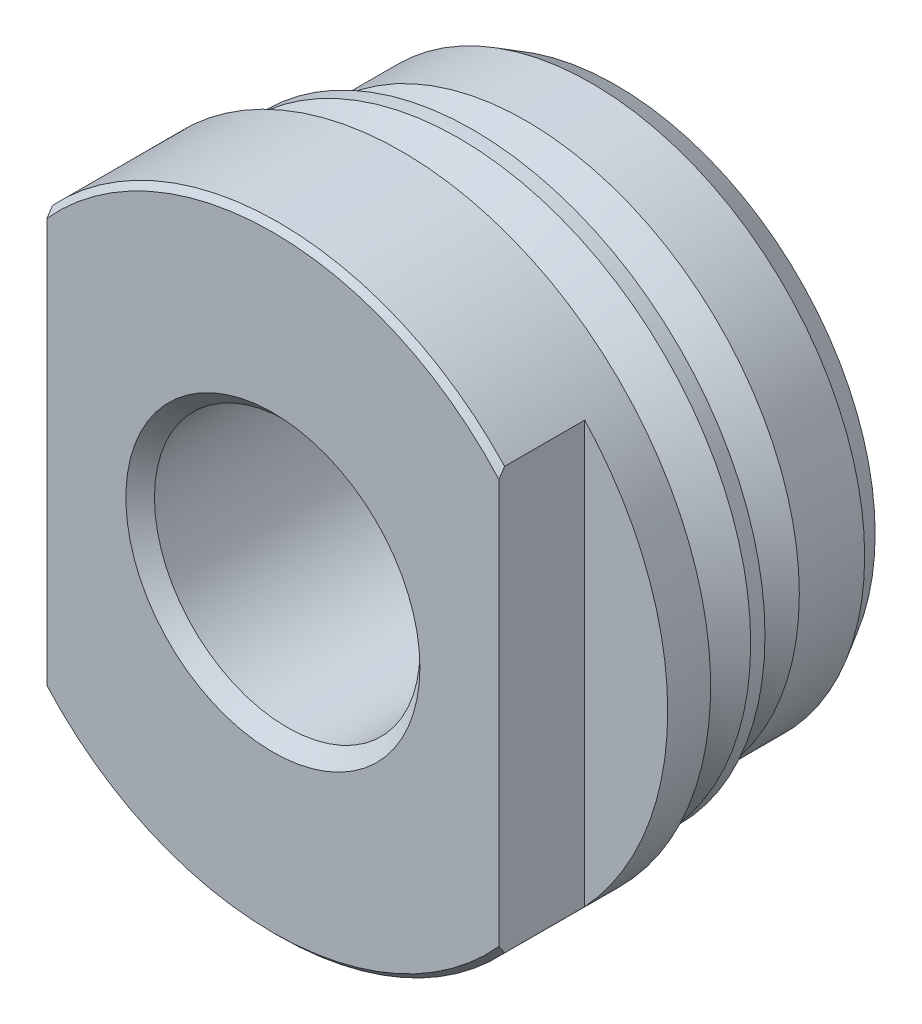
ISO-10303-21;
HEADER;
FILE_DESCRIPTION(('STEP AP214'),'2;1');
FILE_NAME('part.step','',(''),(''),'','','');
FILE_SCHEMA(('AUTOMOTIVE_DESIGN { 1 0 10303 214 1 1 1 1 }'));
ENDSEC;
DATA;
#1=APPLICATION_CONTEXT('core data for automotive mechanical design processes');
#2=APPLICATION_PROTOCOL_DEFINITION('international standard','automotive_design',2000,#1);
#3=PRODUCT_CONTEXT('',#1,'mechanical');
#4=PRODUCT('Part','Part','',(#3));
#5=PRODUCT_RELATED_PRODUCT_CATEGORY('part','',(#4));
#6=PRODUCT_DEFINITION_FORMATION('','',#4);
#7=PRODUCT_DEFINITION_CONTEXT('part definition',#1,'design');
#8=PRODUCT_DEFINITION('design','',#6,#7);
#9=PRODUCT_DEFINITION_SHAPE('','',#8);
#10=(LENGTH_UNIT() NAMED_UNIT(*) SI_UNIT(.MILLI.,.METRE.));
#11=(NAMED_UNIT(*) PLANE_ANGLE_UNIT() SI_UNIT($,.RADIAN.));
#12=(NAMED_UNIT(*) SI_UNIT($,.STERADIAN.) SOLID_ANGLE_UNIT());
#13=UNCERTAINTY_MEASURE_WITH_UNIT(LENGTH_MEASURE(1.E-05),#10,'distance_accuracy_value','');
#14=(GEOMETRIC_REPRESENTATION_CONTEXT(3) GLOBAL_UNCERTAINTY_ASSIGNED_CONTEXT((#13)) GLOBAL_UNIT_ASSIGNED_CONTEXT((#10,
#11,#12)) REPRESENTATION_CONTEXT('',''));
#15=CARTESIAN_POINT('',(0.,0.,0.));
#16=DIRECTION('',(0.,0.,1.));
#17=DIRECTION('',(1.,0.,0.));
#18=AXIS2_PLACEMENT_3D('',#15,#16,#17);
#19=CARTESIAN_POINT('',(0.,0.,12.));
#20=DIRECTION('',(0.,0.,-1.));
#21=DIRECTION('',(-1.,0.,0.));
#22=AXIS2_PLACEMENT_3D('',#19,#20,#21);
#23=CYLINDRICAL_SURFACE('',#22,10.8);
#24=CARTESIAN_POINT('',(0.,0.,11.8));
#25=DIRECTION('',(0.,0.,1.));
#26=DIRECTION('',(1.,0.,0.));
#27=AXIS2_PLACEMENT_3D('',#24,#25,#26);
#28=CIRCLE('',#27,10.8);
#29=CARTESIAN_POINT('',(7.90000000000001,-7.36410211770586,11.8));
#30=VERTEX_POINT('',#29);
#31=CARTESIAN_POINT('',(-7.90000000000001,-7.36410211770586,11.8));
#32=VERTEX_POINT('',#31);
#33=EDGE_CURVE('E114',#30,#32,#28,.F.);
#34=ORIENTED_EDGE('',*,*,#33,.T.);
#35=DIRECTION('',(0.,0.,-1.));
#36=VECTOR('',#35,1.);
#37=CARTESIAN_POINT('',(-7.90000000000001,-7.36410211770586,12.));
#38=LINE('',#37,#36);
#39=CARTESIAN_POINT('',(-7.90000000000001,-7.36410211770586,9.));
#40=VERTEX_POINT('',#39);
#41=EDGE_CURVE('E89',#32,#40,#38,.T.);
#42=ORIENTED_EDGE('',*,*,#41,.T.);
#43=CARTESIAN_POINT('',(0.,0.,9.));
#44=DIRECTION('',(0.,0.,1.));
#45=DIRECTION('',(1.,0.,0.));
#46=AXIS2_PLACEMENT_3D('',#43,#44,#45);
#47=CIRCLE('',#46,10.8);
#48=CARTESIAN_POINT('',(-7.90000000000001,7.36410211770586,9.));
#49=VERTEX_POINT('',#48);
#50=EDGE_CURVE('E93',#49,#40,#47,.T.);
#51=ORIENTED_EDGE('',*,*,#50,.F.);
#52=DIRECTION('',(0.,0.,-1.));
#53=VECTOR('',#52,1.);
#54=CARTESIAN_POINT('',(-7.90000000000001,7.36410211770586,12.));
#55=LINE('',#54,#53);
#56=CARTESIAN_POINT('',(-7.90000000000001,7.36410211770586,11.8));
#57=VERTEX_POINT('',#56);
#58=EDGE_CURVE('E193',#49,#57,#55,.F.);
#59=ORIENTED_EDGE('',*,*,#58,.T.);
#60=CARTESIAN_POINT('',(7.90000000000001,7.36410211770586,11.8));
#61=VERTEX_POINT('',#60);
#62=EDGE_CURVE('E108',#57,#61,#28,.F.);
#63=ORIENTED_EDGE('',*,*,#62,.T.);
#64=DIRECTION('',(0.,0.,-1.));
#65=VECTOR('',#64,1.);
#66=CARTESIAN_POINT('',(7.90000000000001,7.36410211770586,12.));
#67=LINE('',#66,#65);
#68=CARTESIAN_POINT('',(7.90000000000001,7.36410211770586,9.));
#69=VERTEX_POINT('',#68);
#70=EDGE_CURVE('E106',#61,#69,#67,.T.);
#71=ORIENTED_EDGE('',*,*,#70,.T.);
#72=CARTESIAN_POINT('',(0.,0.,9.));
#73=DIRECTION('',(0.,0.,-1.));
#74=DIRECTION('',(-1.,0.,0.));
#75=AXIS2_PLACEMENT_3D('',#72,#73,#74);
#76=CIRCLE('',#75,10.8);
#77=CARTESIAN_POINT('',(7.90000000000001,-7.36410211770586,9.));
#78=VERTEX_POINT('',#77);
#79=EDGE_CURVE('E124',#69,#78,#76,.T.);
#80=ORIENTED_EDGE('',*,*,#79,.T.);
#81=DIRECTION('',(0.,0.,-1.));
#82=VECTOR('',#81,1.);
#83=CARTESIAN_POINT('',(7.90000000000001,-7.36410211770586,12.));
#84=LINE('',#83,#82);
#85=EDGE_CURVE('E110',#78,#30,#84,.F.);
#86=ORIENTED_EDGE('',*,*,#85,.T.);
#87=EDGE_LOOP('',(#34,#42,#51,#59,#63,#71,#80,#86));
#88=FACE_BOUND('',#87,.T.);
#89=CARTESIAN_POINT('',(0.,0.,7.5));
#90=DIRECTION('',(0.,0.,-1.));
#91=DIRECTION('',(-1.,0.,0.));
#92=AXIS2_PLACEMENT_3D('',#89,#90,#91);
#93=CIRCLE('',#92,10.8);
#94=CARTESIAN_POINT('',(-10.8,0.,7.5));
#95=VERTEX_POINT('',#94);
#96=EDGE_CURVE('E101',#95,#95,#93,.T.);
#97=ORIENTED_EDGE('',*,*,#96,.F.);
#98=EDGE_LOOP('',(#97));
#99=FACE_BOUND('',#98,.T.);
#100=ADVANCED_FACE('F33',(#88,#99),#23,.T.);
#101=CARTESIAN_POINT('',(0.,0.,12.));
#102=DIRECTION('',(0.,0.,-1.));
#103=DIRECTION('',(-1.,0.,0.));
#104=AXIS2_PLACEMENT_3D('',#101,#102,#103);
#105=CONICAL_SURFACE('',#104,10.6,0.785398163397448);
#106=CARTESIAN_POINT('',(-7.90000000000001,-22.409004975791,-1.16075554364858));
#107=CARTESIAN_POINT('',(-7.90000000000001,-22.0508772172236,-0.823011495653775));
#108=CARTESIAN_POINT('',(-7.90000000000001,-21.6923116338694,-0.485730650169907));
#109=CARTESIAN_POINT('',(-7.90000000000001,-20.974152972954,0.187739463273151));
#110=CARTESIAN_POINT('',(-7.90000000000001,-20.6145598893184,0.523928724753929));
#111=CARTESIAN_POINT('',(-7.90000000000001,-19.8938852440171,1.19533844847555));
#112=CARTESIAN_POINT('',(-7.90000000000001,-19.5328026594999,1.53055781330608));
#113=CARTESIAN_POINT('',(-7.90000000000001,-18.8092710503213,2.19951794792509));
#114=CARTESIAN_POINT('',(-7.90000000000001,-18.4468220280248,2.53325872027024));
#115=CARTESIAN_POINT('',(-7.90000000000001,-17.7088381753738,3.20952719878338));
#116=CARTESIAN_POINT('',(-7.90000000000001,-17.3332520445957,3.55199895610959));
#117=CARTESIAN_POINT('',(-7.90000000000001,-16.5800688053,4.23472357361541));
#118=CARTESIAN_POINT('',(-7.90000000000001,-16.2024717019499,4.57497643949184));
#119=CARTESIAN_POINT('',(-7.90000000000001,-15.4451673580512,5.25253342938355));
#120=CARTESIAN_POINT('',(-7.90000000000001,-15.0654619862618,5.58983964024203));
#121=CARTESIAN_POINT('',(-7.90000000000001,-14.3031556467119,6.26116184898049));
#122=CARTESIAN_POINT('',(-7.90000000000001,-13.9205547021343,6.59517787315362));
#123=CARTESIAN_POINT('',(-7.90000000000001,-13.1521547280742,7.25882404246039));
#124=CARTESIAN_POINT('',(-7.90000000000001,-12.7663588350255,7.58845781381686));
#125=CARTESIAN_POINT('',(-7.90000000000001,-11.9903868922261,8.24257116234791));
#126=CARTESIAN_POINT('',(-7.90000000000001,-11.6002106776521,8.5670505444556));
#127=CARTESIAN_POINT('',(-7.90000000000001,-10.8133954061554,9.21015351468169));
#128=CARTESIAN_POINT('',(-7.90000000000001,-10.4167424473886,9.52876012983432));
#129=CARTESIAN_POINT('',(-7.90000000000001,-9.61650221145399,10.1571086563831));
#130=CARTESIAN_POINT('',(-7.90000000000001,-9.21291570050936,10.4668515373488));
#131=CARTESIAN_POINT('',(-7.90000000000001,-8.60363251252299,10.9203357217261));
#132=CARTESIAN_POINT('',(-7.90000000000001,-8.40132677564575,11.0686350360993));
#133=CARTESIAN_POINT('',(-7.90000000000001,-7.99422820469506,11.3617750880345));
#134=CARTESIAN_POINT('',(-7.90000000000001,-7.78943544354929,11.5066159266426));
#135=CARTESIAN_POINT('',(-7.90000000000001,-7.37689162284723,11.7923001587738));
#136=CARTESIAN_POINT('',(-7.90000000000001,-7.16913885240697,11.9331410868721));
#137=CARTESIAN_POINT('',(-7.90000000000001,-6.75041245476495,12.2099382314871));
#138=CARTESIAN_POINT('',(-7.90000000000001,-6.53943901402621,12.3458947292747));
#139=CARTESIAN_POINT('',(-7.90000000000001,-6.11473946064056,12.6113724416338));
#140=CARTESIAN_POINT('',(-7.90000000000001,-5.90102923133031,12.7409189819883));
#141=CARTESIAN_POINT('',(-7.90000000000001,-5.46946912044146,12.9930019889505));
#142=CARTESIAN_POINT('',(-7.90000000000001,-5.25161887184102,13.1155378301459));
#143=CARTESIAN_POINT('',(-7.90000000000001,-4.81156106925976,13.3519345644006));
#144=CARTESIAN_POINT('',(-7.90000000000001,-4.58935875804862,13.4658051743744));
#145=CARTESIAN_POINT('',(-7.90000000000001,-4.13994799595975,13.6831340147051));
#146=CARTESIAN_POINT('',(-7.90000000000001,-3.91274104087299,13.7865953060846));
#147=CARTESIAN_POINT('',(-7.90000000000001,-3.56449839003439,13.933734644084));
#148=CARTESIAN_POINT('',(-7.90000000000001,-3.44542292743046,13.9820678490954));
#149=CARTESIAN_POINT('',(-7.90000000000001,-3.20583253299374,14.0750269362474));
#150=CARTESIAN_POINT('',(-7.90000000000001,-3.08531756932179,14.1196527362125));
#151=CARTESIAN_POINT('',(-7.90000000000001,-2.72155606982376,14.2474358576262));
#152=CARTESIAN_POINT('',(-7.90000000000001,-2.47611335129694,14.324490143308));
#153=CARTESIAN_POINT('',(-7.90000000000001,-1.98130625415304,14.4587931594455));
#154=CARTESIAN_POINT('',(-7.90000000000001,-1.7319719851003,14.5161516622916));
#155=CARTESIAN_POINT('',(-7.90000000000001,-1.22918906625964,14.6087596985725));
#156=CARTESIAN_POINT('',(-7.90000000000001,-0.975740903213877,14.6440118282782));
#157=CARTESIAN_POINT('',(-7.90000000000001,-0.463792857135283,14.6905461427397));
#158=CARTESIAN_POINT('',(-7.90000000000001,-0.205268083226577,14.7015598869221));
#159=CARTESIAN_POINT('',(-7.90000000000001,0.311592433975256,14.6980823681367));
#160=CARTESIAN_POINT('',(-7.90000000000001,0.569928185766545,14.6835923325422));
#161=CARTESIAN_POINT('',(-7.90000000000001,1.08501218379488,14.629972376003));
#162=CARTESIAN_POINT('',(-7.90000000000001,1.34175019560777,14.5907458064372));
#163=CARTESIAN_POINT('',(-7.90000000000001,1.85078197276315,14.4899408833264));
#164=CARTESIAN_POINT('',(-7.90000000000001,2.10307453357972,14.428356566555));
#165=CARTESIAN_POINT('',(-7.90000000000001,2.7117833441311,14.2546283009818));
#166=CARTESIAN_POINT('',(-7.90000000000001,3.06523735100172,14.1321587844127));
#167=CARTESIAN_POINT('',(-7.90000000000001,3.75999116311813,13.8566894863437));
#168=CARTESIAN_POINT('',(-7.90000000000001,4.10128281517762,13.7036696624836));
#169=CARTESIAN_POINT('',(-7.90000000000001,4.60651767978826,13.4562460157599));
#170=CARTESIAN_POINT('',(-7.90000000000001,4.7746865728053,13.3702843897633));
#171=CARTESIAN_POINT('',(-7.90000000000001,5.10836648414615,13.1933335116649));
#172=CARTESIAN_POINT('',(-7.90000000000001,5.27387746910793,13.1023441965191));
#173=CARTESIAN_POINT('',(-7.90000000000001,5.60237144808786,12.9160815589019));
#174=CARTESIAN_POINT('',(-7.90000000000001,5.76535544504776,12.8208099977638));
#175=CARTESIAN_POINT('',(-7.90000000000001,6.08906863900119,12.6265352351118));
#176=CARTESIAN_POINT('',(-7.90000000000001,6.24979794429644,12.5275322136827));
#177=CARTESIAN_POINT('',(-7.90000000000001,6.60549172739751,12.3034306907861));
#178=CARTESIAN_POINT('',(-7.90000000000001,6.79993955286214,12.1775128730857));
#179=CARTESIAN_POINT('',(-7.90000000000001,7.18610565128359,11.9215520657389));
#180=CARTESIAN_POINT('',(-7.90000000000001,7.37782378336312,11.7915088642948));
#181=CARTESIAN_POINT('',(-7.90000000000001,7.9494335728376,11.3960939646874));
#182=CARTESIAN_POINT('',(-7.90000000000001,8.32570493982646,11.1254853284221));
#183=CARTESIAN_POINT('',(-7.90000000000001,9.07096199698265,10.5737908364136));
#184=CARTESIAN_POINT('',(-7.90000000000001,9.43994064709899,10.2926955472194));
#185=CARTESIAN_POINT('',(-7.90000000000001,10.1718028937388,9.72277577536293));
#186=CARTESIAN_POINT('',(-7.90000000000001,10.534687109878,9.4339520862784));
#187=CARTESIAN_POINT('',(-7.90000000000001,11.2569986772228,8.84918388557577));
#188=CARTESIAN_POINT('',(-7.90000000000001,11.6164070764972,8.55321603397223));
#189=CARTESIAN_POINT('',(-7.90000000000001,12.3312619153612,7.95652690646887));
#190=CARTESIAN_POINT('',(-7.90000000000001,12.6867082689038,7.65580552767424));
#191=CARTESIAN_POINT('',(-7.90000000000001,13.3941650329122,7.05072054617447));
#192=CARTESIAN_POINT('',(-7.90000000000001,13.7461771207873,6.7463589017697));
#193=CARTESIAN_POINT('',(-7.90000000000001,14.4475023120036,6.13455138397971));
#194=CARTESIAN_POINT('',(-7.90000000000001,14.7968154370055,5.8271055353926));
#195=CARTESIAN_POINT('',(-7.90000000000001,15.7626712988134,4.97076630063849));
#196=CARTESIAN_POINT('',(-7.90000000000001,16.3768060591838,4.41915759157725));
#197=CARTESIAN_POINT('',(-7.90000000000001,17.5999160456333,3.3100852102422));
#198=CARTESIAN_POINT('',(-7.90000000000001,18.2088904982423,2.75262068734549));
#199=CARTESIAN_POINT('',(-7.90000000000001,19.4181695498056,1.63762993398919));
#200=CARTESIAN_POINT('',(-7.90000000000001,20.0185048232777,1.08013694566367));
#201=CARTESIAN_POINT('',(-7.90000000000001,20.9166311937109,0.241465731552848));
#202=CARTESIAN_POINT('',(-7.90000000000001,21.2155834677101,-0.0384710470779498));
#203=CARTESIAN_POINT('',(-7.90000000000001,21.8127941965487,-0.599082164430036));
#204=CARTESIAN_POINT('',(-7.90000000000001,22.1110526532729,-0.879756501143304));
#205=CARTESIAN_POINT('',(-7.90000000000001,22.409004975791,-1.16075554364858));
#206=B_SPLINE_CURVE_WITH_KNOTS('',3,(#106,#107,#108,#109,#110,#111,#112,#113,#114,#115,#116,
#117,#118,#119,#120,#121,#122,#123,#124,#125,#126,#127,#128,#129,#130,#131,#132,#133,#134,#135,
#136,#137,#138,#139,#140,#141,#142,#143,#144,#145,#146,#147,#148,#149,#150,#151,#152,#153,#154,
#155,#156,#157,#158,#159,#160,#161,#162,#163,#164,#165,#166,#167,#168,#169,#170,#171,#172,#173,
#174,#175,#176,#177,#178,#179,#180,#181,#182,#183,#184,#185,#186,#187,#188,#189,#190,#191,#192,
#193,#194,#195,#196,#197,#198,#199,#200,#201,#202,#203,#204,#205),.UNSPECIFIED.,.F.,.F.,(4,2,2,
2,2,2,2,2,2,2,2,2,2,2,2,2,2,2,2,2,2,2,2,2,2,2,2,2,2,2,2,2,2,2,2,2,2,2,2,2,2,2,2,2,2,2,2,2,2,4),
(0.,1.47680084398303,2.95361043662997,4.43170494232693,5.90979689121079,7.43463924547816,
8.95947768330542,10.4831306339924,12.0067713986817,13.529061199459,15.0514084744113,
16.5776236957129,18.1036713270857,18.8561603032413,19.6086272669847,20.3615483830981,
21.1144260723926,21.8640423634022,22.6137254224539,23.3625550285296,24.1111637819653,
24.4966413397435,24.8821274394377,25.6531661864149,26.4198350943959,27.1864139444922,
27.9614408264338,28.7364304111082,29.5144668951426,30.2927110486022,31.4129386577925,
32.5339036154326,33.1004325372613,33.6669685646075,34.2332736647045,34.7995514691434,
35.4944593078476,36.189402881135,37.5795592847123,38.9709978993632,40.3622941806589,
41.7590056007582,43.1557472955699,44.5517686801852,45.947778849263,48.4241915804004,
50.9009691546592,53.3587573768038,54.587427920825,55.8160951232165),.UNSPECIFIED.);
#207=CARTESIAN_POINT('',(-7.90000000000001,-7.06753139363384,12.));
#208=VERTEX_POINT('',#207);
#209=EDGE_CURVE('E85',#32,#208,#206,.T.);
#210=ORIENTED_EDGE('',*,*,#209,.F.);
#211=ORIENTED_EDGE('',*,*,#33,.F.);
#212=CARTESIAN_POINT('',(7.90000000000001,22.409004975791,-1.16075554364858));
#213=CARTESIAN_POINT('',(7.90000000000001,22.0508772172236,-0.823011495653775));
#214=CARTESIAN_POINT('',(7.90000000000001,21.6923116338694,-0.485730650169907));
#215=CARTESIAN_POINT('',(7.90000000000001,20.974152972954,0.187739463273151));
#216=CARTESIAN_POINT('',(7.90000000000001,20.6145598893184,0.523928724753929));
#217=CARTESIAN_POINT('',(7.90000000000001,19.8938852440171,1.19533844847555));
#218=CARTESIAN_POINT('',(7.90000000000001,19.5328026594999,1.53055781330608));
#219=CARTESIAN_POINT('',(7.90000000000001,18.8092710503213,2.19951794792509));
#220=CARTESIAN_POINT('',(7.90000000000001,18.4468220280248,2.53325872027024));
#221=CARTESIAN_POINT('',(7.90000000000001,17.7088381753738,3.20952719878338));
#222=CARTESIAN_POINT('',(7.90000000000001,17.3332520445957,3.55199895610959));
#223=CARTESIAN_POINT('',(7.90000000000001,16.5800688053,4.23472357361541));
#224=CARTESIAN_POINT('',(7.90000000000001,16.2024717019499,4.57497643949184));
#225=CARTESIAN_POINT('',(7.90000000000001,15.4451673580512,5.25253342938355));
#226=CARTESIAN_POINT('',(7.90000000000001,15.0654619862618,5.58983964024203));
#227=CARTESIAN_POINT('',(7.90000000000001,14.3031556467119,6.26116184898049));
#228=CARTESIAN_POINT('',(7.90000000000001,13.9205547021343,6.59517787315362));
#229=CARTESIAN_POINT('',(7.90000000000001,13.1521547280742,7.25882404246039));
#230=CARTESIAN_POINT('',(7.90000000000001,12.7663588350255,7.58845781381686));
#231=CARTESIAN_POINT('',(7.90000000000001,11.9903868922261,8.24257116234791));
#232=CARTESIAN_POINT('',(7.90000000000001,11.6002106776521,8.5670505444556));
#233=CARTESIAN_POINT('',(7.90000000000001,10.8133954061554,9.21015351468169));
#234=CARTESIAN_POINT('',(7.90000000000001,10.4167424473886,9.52876012983432));
#235=CARTESIAN_POINT('',(7.90000000000001,9.61650221145399,10.1571086563831));
#236=CARTESIAN_POINT('',(7.90000000000001,9.21291570050936,10.4668515373488));
#237=CARTESIAN_POINT('',(7.90000000000001,8.60363251252299,10.9203357217261));
#238=CARTESIAN_POINT('',(7.90000000000001,8.40132677564575,11.0686350360993));
#239=CARTESIAN_POINT('',(7.90000000000001,7.99422820469506,11.3617750880345));
#240=CARTESIAN_POINT('',(7.90000000000001,7.78943544354929,11.5066159266426));
#241=CARTESIAN_POINT('',(7.90000000000001,7.37689162284723,11.7923001587738));
#242=CARTESIAN_POINT('',(7.90000000000001,7.16913885240697,11.9331410868721));
#243=CARTESIAN_POINT('',(7.90000000000001,6.75041245476495,12.2099382314871));
#244=CARTESIAN_POINT('',(7.90000000000001,6.53943901402621,12.3458947292747));
#245=CARTESIAN_POINT('',(7.90000000000001,6.11473946064056,12.6113724416338));
#246=CARTESIAN_POINT('',(7.90000000000001,5.90102923133031,12.7409189819883));
#247=CARTESIAN_POINT('',(7.90000000000001,5.46946912044146,12.9930019889505));
#248=CARTESIAN_POINT('',(7.90000000000001,5.25161887184102,13.1155378301459));
#249=CARTESIAN_POINT('',(7.90000000000001,4.81156106925976,13.3519345644006));
#250=CARTESIAN_POINT('',(7.90000000000001,4.58935875804862,13.4658051743744));
#251=CARTESIAN_POINT('',(7.90000000000001,4.13994799595975,13.6831340147051));
#252=CARTESIAN_POINT('',(7.90000000000001,3.91274104087299,13.7865953060846));
#253=CARTESIAN_POINT('',(7.90000000000001,3.56449839003439,13.933734644084));
#254=CARTESIAN_POINT('',(7.90000000000001,3.44542292743046,13.9820678490954));
#255=CARTESIAN_POINT('',(7.90000000000001,3.20583253299374,14.0750269362474));
#256=CARTESIAN_POINT('',(7.90000000000001,3.08531756932179,14.1196527362125));
#257=CARTESIAN_POINT('',(7.90000000000001,2.72155606982376,14.2474358576262));
#258=CARTESIAN_POINT('',(7.90000000000001,2.47611335129694,14.324490143308));
#259=CARTESIAN_POINT('',(7.90000000000001,1.98130625415304,14.4587931594455));
#260=CARTESIAN_POINT('',(7.90000000000001,1.7319719851003,14.5161516622916));
#261=CARTESIAN_POINT('',(7.90000000000001,1.22918906625964,14.6087596985725));
#262=CARTESIAN_POINT('',(7.90000000000001,0.975740903213877,14.6440118282782));
#263=CARTESIAN_POINT('',(7.90000000000001,0.463792857135283,14.6905461427397));
#264=CARTESIAN_POINT('',(7.90000000000001,0.205268083226577,14.7015598869221));
#265=CARTESIAN_POINT('',(7.90000000000001,-0.311592433975256,14.6980823681367));
#266=CARTESIAN_POINT('',(7.90000000000001,-0.569928185766545,14.6835923325422));
#267=CARTESIAN_POINT('',(7.90000000000001,-1.08501218379488,14.629972376003));
#268=CARTESIAN_POINT('',(7.90000000000001,-1.34175019560777,14.5907458064372));
#269=CARTESIAN_POINT('',(7.90000000000001,-1.85078197276315,14.4899408833264));
#270=CARTESIAN_POINT('',(7.90000000000001,-2.10307453357972,14.428356566555));
#271=CARTESIAN_POINT('',(7.90000000000001,-2.7117833441311,14.2546283009818));
#272=CARTESIAN_POINT('',(7.90000000000001,-3.06523735100172,14.1321587844127));
#273=CARTESIAN_POINT('',(7.90000000000001,-3.75999116311813,13.8566894863437));
#274=CARTESIAN_POINT('',(7.90000000000001,-4.10128281517762,13.7036696624836));
#275=CARTESIAN_POINT('',(7.90000000000001,-4.60651767978826,13.4562460157599));
#276=CARTESIAN_POINT('',(7.90000000000001,-4.7746865728053,13.3702843897633));
#277=CARTESIAN_POINT('',(7.90000000000001,-5.10836648414615,13.1933335116649));
#278=CARTESIAN_POINT('',(7.90000000000001,-5.27387746910793,13.1023441965191));
#279=CARTESIAN_POINT('',(7.90000000000001,-5.60237144808786,12.9160815589019));
#280=CARTESIAN_POINT('',(7.90000000000001,-5.76535544504776,12.8208099977638));
#281=CARTESIAN_POINT('',(7.90000000000001,-6.08906863900119,12.6265352351118));
#282=CARTESIAN_POINT('',(7.90000000000001,-6.24979794429644,12.5275322136827));
#283=CARTESIAN_POINT('',(7.90000000000001,-6.60549172739751,12.3034306907861));
#284=CARTESIAN_POINT('',(7.90000000000001,-6.79993955286214,12.1775128730857));
#285=CARTESIAN_POINT('',(7.90000000000001,-7.18610565128359,11.9215520657389));
#286=CARTESIAN_POINT('',(7.90000000000001,-7.37782378336312,11.7915088642948));
#287=CARTESIAN_POINT('',(7.90000000000001,-7.9494335728376,11.3960939646874));
#288=CARTESIAN_POINT('',(7.90000000000001,-8.32570493982646,11.1254853284221));
#289=CARTESIAN_POINT('',(7.90000000000001,-9.07096199698265,10.5737908364136));
#290=CARTESIAN_POINT('',(7.90000000000001,-9.43994064709899,10.2926955472194));
#291=CARTESIAN_POINT('',(7.90000000000001,-10.1718028937388,9.72277577536293));
#292=CARTESIAN_POINT('',(7.90000000000001,-10.534687109878,9.4339520862784));
#293=CARTESIAN_POINT('',(7.90000000000001,-11.2569986772228,8.84918388557577));
#294=CARTESIAN_POINT('',(7.90000000000001,-11.6164070764972,8.55321603397223));
#295=CARTESIAN_POINT('',(7.90000000000001,-12.3312619153612,7.95652690646887));
#296=CARTESIAN_POINT('',(7.90000000000001,-12.6867082689038,7.65580552767424));
#297=CARTESIAN_POINT('',(7.90000000000001,-13.3941650329122,7.05072054617447));
#298=CARTESIAN_POINT('',(7.90000000000001,-13.7461771207873,6.7463589017697));
#299=CARTESIAN_POINT('',(7.90000000000001,-14.4475023120036,6.13455138397971));
#300=CARTESIAN_POINT('',(7.90000000000001,-14.7968154370055,5.8271055353926));
#301=CARTESIAN_POINT('',(7.90000000000001,-15.7626712988134,4.97076630063849));
#302=CARTESIAN_POINT('',(7.90000000000001,-16.3768060591838,4.41915759157725));
#303=CARTESIAN_POINT('',(7.90000000000001,-17.5999160456333,3.3100852102422));
#304=CARTESIAN_POINT('',(7.90000000000001,-18.2088904982423,2.75262068734549));
#305=CARTESIAN_POINT('',(7.90000000000001,-19.4181695498056,1.63762993398919));
#306=CARTESIAN_POINT('',(7.90000000000001,-20.0185048232777,1.08013694566367));
#307=CARTESIAN_POINT('',(7.90000000000001,-20.9166311937109,0.241465731552848));
#308=CARTESIAN_POINT('',(7.90000000000001,-21.2155834677101,-0.0384710470779498));
#309=CARTESIAN_POINT('',(7.90000000000001,-21.8127941965487,-0.599082164430036));
#310=CARTESIAN_POINT('',(7.90000000000001,-22.1110526532729,-0.879756501143304));
#311=CARTESIAN_POINT('',(7.90000000000001,-22.409004975791,-1.16075554364858));
#312=B_SPLINE_CURVE_WITH_KNOTS('',3,(#212,#213,#214,#215,#216,#217,#218,#219,#220,#221,#222,
#223,#224,#225,#226,#227,#228,#229,#230,#231,#232,#233,#234,#235,#236,#237,#238,#239,#240,#241,
#242,#243,#244,#245,#246,#247,#248,#249,#250,#251,#252,#253,#254,#255,#256,#257,#258,#259,#260,
#261,#262,#263,#264,#265,#266,#267,#268,#269,#270,#271,#272,#273,#274,#275,#276,#277,#278,#279,
#280,#281,#282,#283,#284,#285,#286,#287,#288,#289,#290,#291,#292,#293,#294,#295,#296,#297,#298,
#299,#300,#301,#302,#303,#304,#305,#306,#307,#308,#309,#310,#311),.UNSPECIFIED.,.F.,.F.,(4,2,2,
2,2,2,2,2,2,2,2,2,2,2,2,2,2,2,2,2,2,2,2,2,2,2,2,2,2,2,2,2,2,2,2,2,2,2,2,2,2,2,2,2,2,2,2,2,2,4),
(0.,1.47680084398303,2.95361043662997,4.43170494232693,5.90979689121079,7.43463924547816,
8.95947768330542,10.4831306339924,12.0067713986817,13.529061199459,15.0514084744113,
16.5776236957129,18.1036713270857,18.8561603032413,19.6086272669847,20.3615483830981,
21.1144260723926,21.8640423634022,22.6137254224539,23.3625550285296,24.1111637819653,
24.4966413397435,24.8821274394377,25.6531661864149,26.4198350943959,27.1864139444922,
27.9614408264338,28.7364304111082,29.5144668951426,30.2927110486022,31.4129386577925,
32.5339036154326,33.1004325372613,33.6669685646075,34.2332736647045,34.7995514691434,
35.4944593078476,36.189402881135,37.5795592847123,38.9709978993632,40.3622941806589,
41.7590056007582,43.1557472955699,44.5517686801852,45.947778849263,48.4241915804004,
50.9009691546592,53.3587573768038,54.587427920825,55.8160951232165),.UNSPECIFIED.);
#313=CARTESIAN_POINT('',(7.90000000000001,-7.06753139363384,12.));
#314=VERTEX_POINT('',#313);
#315=EDGE_CURVE('E105',#314,#30,#312,.T.);
#316=ORIENTED_EDGE('',*,*,#315,.F.);
#317=CARTESIAN_POINT('',(0.,0.,12.));
#318=DIRECTION('',(0.,0.,1.));
#319=DIRECTION('',(1.,0.,0.));
#320=AXIS2_PLACEMENT_3D('',#317,#318,#319);
#321=CIRCLE('',#320,10.6);
#322=EDGE_CURVE('E55',#208,#314,#321,.T.);
#323=ORIENTED_EDGE('',*,*,#322,.F.);
#324=EDGE_LOOP('',(#210,#211,#316,#323));
#325=FACE_BOUND('',#324,.T.);
#326=ADVANCED_FACE('F104',(#325),#105,.T.);
#327=CARTESIAN_POINT('',(0.,0.,12.));
#328=DIRECTION('',(0.,0.,1.));
#329=DIRECTION('',(1.,0.,0.));
#330=AXIS2_PLACEMENT_3D('',#327,#328,#329);
#331=PLANE('',#330);
#332=CARTESIAN_POINT('',(0.,0.,12.));
#333=DIRECTION('',(0.,0.,1.));
#334=DIRECTION('',(1.,0.,0.));
#335=AXIS2_PLACEMENT_3D('',#332,#333,#334);
#336=CIRCLE('',#335,5.139);
#337=CARTESIAN_POINT('',(5.139,0.,12.));
#338=VERTEX_POINT('',#337);
#339=EDGE_CURVE('E216',#338,#338,#336,.F.);
#340=ORIENTED_EDGE('',*,*,#339,.T.);
#341=EDGE_LOOP('',(#340));
#342=FACE_BOUND('',#341,.T.);
#343=DIRECTION('',(0.,1.,0.));
#344=VECTOR('',#343,1.);
#345=CARTESIAN_POINT('',(-7.90000000000001,37.5,12.));
#346=LINE('',#345,#344);
#347=CARTESIAN_POINT('',(-7.90000000000001,7.06753139363384,12.));
#348=VERTEX_POINT('',#347);
#349=EDGE_CURVE('E48',#208,#348,#346,.T.);
#350=ORIENTED_EDGE('',*,*,#349,.F.);
#351=ORIENTED_EDGE('',*,*,#322,.T.);
#352=DIRECTION('',(0.,-1.,0.));
#353=VECTOR('',#352,1.);
#354=CARTESIAN_POINT('',(7.90000000000001,37.5,12.));
#355=LINE('',#354,#353);
#356=CARTESIAN_POINT('',(7.90000000000001,7.06753139363384,12.));
#357=VERTEX_POINT('',#356);
#358=EDGE_CURVE('E198',#357,#314,#355,.T.);
#359=ORIENTED_EDGE('',*,*,#358,.F.);
#360=EDGE_CURVE('E99',#357,#348,#321,.T.);
#361=ORIENTED_EDGE('',*,*,#360,.T.);
#362=EDGE_LOOP('',(#350,#351,#359,#361));
#363=FACE_BOUND('',#362,.T.);
#364=ADVANCED_FACE('F97',(#342,#363),#331,.T.);
#365=EDGE_CURVE('E94',#348,#57,#206,.T.);
#366=ORIENTED_EDGE('',*,*,#365,.F.);
#367=ORIENTED_EDGE('',*,*,#360,.F.);
#368=EDGE_CURVE('E123',#61,#357,#312,.T.);
#369=ORIENTED_EDGE('',*,*,#368,.F.);
#370=ORIENTED_EDGE('',*,*,#62,.F.);
#371=EDGE_LOOP('',(#366,#367,#369,#370));
#372=FACE_BOUND('',#371,.T.);
#373=ADVANCED_FACE('F125',(#372),#105,.T.);
#374=CARTESIAN_POINT('',(17.9,37.5,9.));
#375=DIRECTION('',(0.,0.,-1.));
#376=DIRECTION('',(-1.,0.,0.));
#377=AXIS2_PLACEMENT_3D('',#374,#375,#376);
#378=PLANE('',#377);
#379=DIRECTION('',(0.,-1.,0.));
#380=VECTOR('',#379,1.);
#381=CARTESIAN_POINT('',(7.90000000000001,37.5,9.));
#382=LINE('',#381,#380);
#383=EDGE_CURVE('E199',#69,#78,#382,.T.);
#384=ORIENTED_EDGE('',*,*,#383,.T.);
#385=ORIENTED_EDGE('',*,*,#79,.F.);
#386=EDGE_LOOP('',(#384,#385));
#387=FACE_BOUND('',#386,.T.);
#388=ADVANCED_FACE('F134',(#387),#378,.F.);
#389=CARTESIAN_POINT('',(7.90000000000001,37.5,9.));
#390=DIRECTION('',(-1.,0.,0.));
#391=DIRECTION('',(0.,0.,1.));
#392=AXIS2_PLACEMENT_3D('',#389,#390,#391);
#393=PLANE('',#392);
#394=ORIENTED_EDGE('',*,*,#368,.T.);
#395=ORIENTED_EDGE('',*,*,#358,.T.);
#396=ORIENTED_EDGE('',*,*,#315,.T.);
#397=ORIENTED_EDGE('',*,*,#85,.F.);
#398=ORIENTED_EDGE('',*,*,#383,.F.);
#399=ORIENTED_EDGE('',*,*,#70,.F.);
#400=EDGE_LOOP('',(#394,#395,#396,#397,#398,#399));
#401=FACE_BOUND('',#400,.T.);
#402=ADVANCED_FACE('F128',(#401),#393,.F.);
#403=CARTESIAN_POINT('',(-17.9,37.5,9.));
#404=DIRECTION('',(0.,0.,1.));
#405=DIRECTION('',(1.,0.,0.));
#406=AXIS2_PLACEMENT_3D('',#403,#404,#405);
#407=PLANE('',#406);
#408=ORIENTED_EDGE('',*,*,#50,.T.);
#409=DIRECTION('',(0.,1.,0.));
#410=VECTOR('',#409,1.);
#411=CARTESIAN_POINT('',(-7.90000000000001,37.5,9.));
#412=LINE('',#411,#410);
#413=EDGE_CURVE('E100',#40,#49,#412,.T.);
#414=ORIENTED_EDGE('',*,*,#413,.T.);
#415=EDGE_LOOP('',(#408,#414));
#416=FACE_BOUND('',#415,.T.);
#417=ADVANCED_FACE('F133',(#416),#407,.T.);
#418=CARTESIAN_POINT('',(-7.90000000000001,37.5,9.));
#419=DIRECTION('',(1.,0.,0.));
#420=DIRECTION('',(0.,0.,-1.));
#421=AXIS2_PLACEMENT_3D('',#418,#419,#420);
#422=PLANE('',#421);
#423=ORIENTED_EDGE('',*,*,#209,.T.);
#424=ORIENTED_EDGE('',*,*,#349,.T.);
#425=ORIENTED_EDGE('',*,*,#365,.T.);
#426=ORIENTED_EDGE('',*,*,#58,.F.);
#427=ORIENTED_EDGE('',*,*,#413,.F.);
#428=ORIENTED_EDGE('',*,*,#41,.F.);
#429=EDGE_LOOP('',(#423,#424,#425,#426,#427,#428));
#430=FACE_BOUND('',#429,.T.);
#431=ADVANCED_FACE('F86',(#430),#422,.F.);
#432=CARTESIAN_POINT('',(0.,13.6,7.5));
#433=DIRECTION('',(0.,0.,-1.));
#434=DIRECTION('',(-1.,0.,0.));
#435=AXIS2_PLACEMENT_3D('',#432,#433,#434);
#436=PLANE('',#435);
#437=CARTESIAN_POINT('',(0.,0.,7.5));
#438=DIRECTION('',(0.,0.,1.));
#439=DIRECTION('',(1.,0.,0.));
#440=AXIS2_PLACEMENT_3D('',#437,#438,#439);
#441=CIRCLE('',#440,8.6);
#442=CARTESIAN_POINT('',(8.6,0.,7.5));
#443=VERTEX_POINT('',#442);
#444=EDGE_CURVE('E189',#443,#443,#441,.T.);
#445=ORIENTED_EDGE('',*,*,#444,.T.);
#446=EDGE_LOOP('',(#445));
#447=FACE_BOUND('',#446,.T.);
#448=ORIENTED_EDGE('',*,*,#96,.T.);
#449=EDGE_LOOP('',(#448));
#450=FACE_BOUND('',#449,.T.);
#451=ADVANCED_FACE('F271',(#447,#450),#436,.T.);
#452=CARTESIAN_POINT('',(0.,0.,0.));
#453=DIRECTION('',(0.,0.,1.));
#454=DIRECTION('',(1.,0.,0.));
#455=AXIS2_PLACEMENT_3D('',#452,#453,#454);
#456=CYLINDRICAL_SURFACE('',#455,8.6);
#457=CARTESIAN_POINT('',(0.,0.,7.09999999999999));
#458=DIRECTION('',(0.,0.,1.));
#459=DIRECTION('',(1.,0.,0.));
#460=AXIS2_PLACEMENT_3D('',#457,#458,#459);
#461=CIRCLE('',#460,8.6);
#462=CARTESIAN_POINT('',(8.6,0.,7.09999999999999));
#463=VERTEX_POINT('',#462);
#464=EDGE_CURVE('E186',#463,#463,#461,.T.);
#465=ORIENTED_EDGE('',*,*,#464,.T.);
#466=EDGE_LOOP('',(#465));
#467=FACE_BOUND('',#466,.T.);
#468=ORIENTED_EDGE('',*,*,#444,.F.);
#469=EDGE_LOOP('',(#468));
#470=FACE_BOUND('',#469,.T.);
#471=ADVANCED_FACE('F267',(#467,#470),#456,.T.);
#472=CARTESIAN_POINT('',(0.,0.,7.09999999999999));
#473=DIRECTION('',(0.,0.,-1.));
#474=DIRECTION('',(-1.,0.,0.));
#475=AXIS2_PLACEMENT_3D('',#472,#473,#474);
#476=CONICAL_SURFACE('',#475,8.6,0.78539816339745);
#477=CARTESIAN_POINT('',(0.,0.,5.5));
#478=DIRECTION('',(0.,0.,1.));
#479=DIRECTION('',(1.,0.,0.));
#480=AXIS2_PLACEMENT_3D('',#477,#478,#479);
#481=CIRCLE('',#480,10.2);
#482=CARTESIAN_POINT('',(10.2,0.,5.5));
#483=VERTEX_POINT('',#482);
#484=EDGE_CURVE('E183',#483,#483,#481,.T.);
#485=ORIENTED_EDGE('',*,*,#484,.T.);
#486=EDGE_LOOP('',(#485));
#487=FACE_BOUND('',#486,.T.);
#488=ORIENTED_EDGE('',*,*,#464,.F.);
#489=EDGE_LOOP('',(#488));
#490=FACE_BOUND('',#489,.T.);
#491=ADVANCED_FACE('F263',(#487,#490),#476,.T.);
#492=CARTESIAN_POINT('',(0.,0.,0.));
#493=DIRECTION('',(0.,0.,1.));
#494=DIRECTION('',(1.,0.,0.));
#495=AXIS2_PLACEMENT_3D('',#492,#493,#494);
#496=CYLINDRICAL_SURFACE('',#495,10.2);
#497=CARTESIAN_POINT('',(0.,0.,5.));
#498=DIRECTION('',(0.,0.,1.));
#499=DIRECTION('',(1.,0.,0.));
#500=AXIS2_PLACEMENT_3D('',#497,#498,#499);
#501=CIRCLE('',#500,10.2);
#502=CARTESIAN_POINT('',(10.2,0.,5.));
#503=VERTEX_POINT('',#502);
#504=EDGE_CURVE('E174',#503,#503,#501,.T.);
#505=ORIENTED_EDGE('',*,*,#504,.T.);
#506=EDGE_LOOP('',(#505));
#507=FACE_BOUND('',#506,.T.);
#508=ORIENTED_EDGE('',*,*,#484,.F.);
#509=EDGE_LOOP('',(#508));
#510=FACE_BOUND('',#509,.T.);
#511=ADVANCED_FACE('F144',(#507,#510),#496,.T.);
#512=CARTESIAN_POINT('',(0.,0.,5.));
#513=DIRECTION('',(0.,0.,1.));
#514=DIRECTION('',(1.,0.,0.));
#515=AXIS2_PLACEMENT_3D('',#512,#513,#514);
#516=PLANE('',#515);
#517=ORIENTED_EDGE('',*,*,#504,.F.);
#518=EDGE_LOOP('',(#517));
#519=FACE_BOUND('',#518,.T.);
#520=CARTESIAN_POINT('',(0.,0.,5.));
#521=DIRECTION('',(0.,0.,1.));
#522=DIRECTION('',(1.,0.,0.));
#523=AXIS2_PLACEMENT_3D('',#520,#521,#522);
#524=CIRCLE('',#523,8.6);
#525=CARTESIAN_POINT('',(8.6,0.,5.));
#526=VERTEX_POINT('',#525);
#527=EDGE_CURVE('E171',#526,#526,#524,.T.);
#528=ORIENTED_EDGE('',*,*,#527,.T.);
#529=EDGE_LOOP('',(#528));
#530=FACE_BOUND('',#529,.T.);
#531=ADVANCED_FACE('F140',(#519,#530),#516,.F.);
#532=CARTESIAN_POINT('',(0.,0.,0.));
#533=DIRECTION('',(0.,0.,1.));
#534=DIRECTION('',(1.,0.,0.));
#535=AXIS2_PLACEMENT_3D('',#532,#533,#534);
#536=CYLINDRICAL_SURFACE('',#535,8.6);
#537=CARTESIAN_POINT('',(0.,0.,4.1));
#538=DIRECTION('',(0.,0.,1.));
#539=DIRECTION('',(1.,0.,0.));
#540=AXIS2_PLACEMENT_3D('',#537,#538,#539);
#541=CIRCLE('',#540,8.6);
#542=CARTESIAN_POINT('',(8.6,0.,4.1));
#543=VERTEX_POINT('',#542);
#544=EDGE_CURVE('E170',#543,#543,#541,.T.);
#545=ORIENTED_EDGE('',*,*,#544,.T.);
#546=EDGE_LOOP('',(#545));
#547=FACE_BOUND('',#546,.T.);
#548=ORIENTED_EDGE('',*,*,#527,.F.);
#549=EDGE_LOOP('',(#548));
#550=FACE_BOUND('',#549,.T.);
#551=ADVANCED_FACE('F143',(#547,#550),#536,.T.);
#552=CARTESIAN_POINT('',(0.,0.,4.1));
#553=DIRECTION('',(0.,0.,-1.));
#554=DIRECTION('',(-1.,0.,0.));
#555=AXIS2_PLACEMENT_3D('',#552,#553,#554);
#556=CONICAL_SURFACE('',#555,8.6,0.785398163397442);
#557=CARTESIAN_POINT('',(0.,0.,3.14999999999998));
#558=DIRECTION('',(0.,0.,1.));
#559=DIRECTION('',(1.,0.,0.));
#560=AXIS2_PLACEMENT_3D('',#557,#558,#559);
#561=CIRCLE('',#560,9.55);
#562=CARTESIAN_POINT('',(9.55,0.,3.14999999999998));
#563=VERTEX_POINT('',#562);
#564=EDGE_CURVE('E168',#563,#563,#561,.T.);
#565=ORIENTED_EDGE('',*,*,#564,.T.);
#566=EDGE_LOOP('',(#565));
#567=FACE_BOUND('',#566,.T.);
#568=ORIENTED_EDGE('',*,*,#544,.F.);
#569=EDGE_LOOP('',(#568));
#570=FACE_BOUND('',#569,.T.);
#571=ADVANCED_FACE('F152',(#567,#570),#556,.T.);
#572=CARTESIAN_POINT('',(0.,0.,0.));
#573=DIRECTION('',(0.,0.,1.));
#574=DIRECTION('',(1.,0.,0.));
#575=AXIS2_PLACEMENT_3D('',#572,#573,#574);
#576=PLANE('',#575);
#577=CARTESIAN_POINT('',(0.,0.,0.));
#578=DIRECTION('',(0.,0.,1.));
#579=DIRECTION('',(1.,0.,0.));
#580=AXIS2_PLACEMENT_3D('',#577,#578,#579);
#581=CIRCLE('',#580,9.05);
#582=CARTESIAN_POINT('',(9.05,0.,0.));
#583=VERTEX_POINT('',#582);
#584=EDGE_CURVE('E11',#583,#583,#581,.F.);
#585=ORIENTED_EDGE('',*,*,#584,.T.);
#586=EDGE_LOOP('',(#585));
#587=FACE_BOUND('',#586,.T.);
#588=CARTESIAN_POINT('',(0.,0.,0.));
#589=DIRECTION('',(0.,0.,-1.));
#590=DIRECTION('',(-1.,0.,0.));
#591=AXIS2_PLACEMENT_3D('',#588,#589,#590);
#592=CIRCLE('',#591,7.);
#593=CARTESIAN_POINT('',(-7.,0.,0.));
#594=VERTEX_POINT('',#593);
#595=EDGE_CURVE('E227',#594,#594,#592,.T.);
#596=ORIENTED_EDGE('',*,*,#595,.F.);
#597=EDGE_LOOP('',(#596));
#598=FACE_BOUND('',#597,.T.);
#599=ADVANCED_FACE('F149',(#587,#598),#576,.F.);
#600=CARTESIAN_POINT('',(0.,0.,5.));
#601=DIRECTION('',(0.,0.,-1.));
#602=DIRECTION('',(-1.,0.,0.));
#603=AXIS2_PLACEMENT_3D('',#600,#601,#602);
#604=CYLINDRICAL_SURFACE('',#603,9.55);
#605=CARTESIAN_POINT('',(0.,0.,0.866025403784443));
#606=DIRECTION('',(0.,0.,1.));
#607=DIRECTION('',(1.,0.,0.));
#608=AXIS2_PLACEMENT_3D('',#605,#606,#607);
#609=CIRCLE('',#608,9.55);
#610=CARTESIAN_POINT('',(9.55,0.,0.866025403784443));
#611=VERTEX_POINT('',#610);
#612=EDGE_CURVE('E41',#611,#611,#609,.T.);
#613=ORIENTED_EDGE('',*,*,#612,.T.);
#614=EDGE_LOOP('',(#613));
#615=FACE_BOUND('',#614,.T.);
#616=ORIENTED_EDGE('',*,*,#564,.F.);
#617=EDGE_LOOP('',(#616));
#618=FACE_BOUND('',#617,.T.);
#619=ADVANCED_FACE('F151',(#615,#618),#604,.T.);
#620=CARTESIAN_POINT('',(0.,0.,3.));
#621=DIRECTION('',(0.,0.,-1.));
#622=DIRECTION('',(-1.,0.,0.));
#623=AXIS2_PLACEMENT_3D('',#620,#621,#622);
#624=CYLINDRICAL_SURFACE('',#623,7.);
#625=CARTESIAN_POINT('',(0.,0.,3.));
#626=DIRECTION('',(0.,0.,-1.));
#627=DIRECTION('',(-1.,0.,0.));
#628=AXIS2_PLACEMENT_3D('',#625,#626,#627);
#629=CIRCLE('',#628,7.);
#630=CARTESIAN_POINT('',(-7.,0.,3.));
#631=VERTEX_POINT('',#630);
#632=EDGE_CURVE('E177',#631,#631,#629,.T.);
#633=ORIENTED_EDGE('',*,*,#632,.F.);
#634=EDGE_LOOP('',(#633));
#635=FACE_BOUND('',#634,.T.);
#636=ORIENTED_EDGE('',*,*,#595,.T.);
#637=EDGE_LOOP('',(#636));
#638=FACE_BOUND('',#637,.T.);
#639=ADVANCED_FACE('F155',(#635,#638),#624,.F.);
#640=CARTESIAN_POINT('',(0.,0.,3.));
#641=DIRECTION('',(0.,0.,-1.));
#642=DIRECTION('',(-1.,0.,0.));
#643=AXIS2_PLACEMENT_3D('',#640,#641,#642);
#644=PLANE('',#643);
#645=CARTESIAN_POINT('',(0.,0.,3.));
#646=DIRECTION('',(0.,0.,-1.));
#647=DIRECTION('',(-1.,0.,0.));
#648=AXIS2_PLACEMENT_3D('',#645,#646,#647);
#649=CIRCLE('',#648,4.639);
#650=CARTESIAN_POINT('',(-4.639,0.,3.));
#651=VERTEX_POINT('',#650);
#652=EDGE_CURVE('E225',#651,#651,#649,.T.);
#653=ORIENTED_EDGE('',*,*,#652,.F.);
#654=EDGE_LOOP('',(#653));
#655=FACE_BOUND('',#654,.T.);
#656=ORIENTED_EDGE('',*,*,#632,.T.);
#657=EDGE_LOOP('',(#656));
#658=FACE_BOUND('',#657,.T.);
#659=ADVANCED_FACE('F160',(#655,#658),#644,.T.);
#660=CARTESIAN_POINT('',(0.,0.,0.));
#661=DIRECTION('',(0.,0.,1.));
#662=DIRECTION('',(1.,0.,0.));
#663=AXIS2_PLACEMENT_3D('',#660,#661,#662);
#664=CYLINDRICAL_SURFACE('',#663,4.639);
#665=CARTESIAN_POINT('',(0.,0.,11.5));
#666=DIRECTION('',(0.,0.,1.));
#667=DIRECTION('',(1.,0.,0.));
#668=AXIS2_PLACEMENT_3D('',#665,#666,#667);
#669=CIRCLE('',#668,4.639);
#670=CARTESIAN_POINT('',(4.639,0.,11.5));
#671=VERTEX_POINT('',#670);
#672=EDGE_CURVE('E213',#671,#671,#669,.T.);
#673=ORIENTED_EDGE('',*,*,#672,.T.);
#674=EDGE_LOOP('',(#673));
#675=FACE_BOUND('',#674,.T.);
#676=ORIENTED_EDGE('',*,*,#652,.T.);
#677=EDGE_LOOP('',(#676));
#678=FACE_BOUND('',#677,.T.);
#679=ADVANCED_FACE('F235',(#675,#678),#664,.F.);
#680=CARTESIAN_POINT('',(0.,0.,11.5));
#681=DIRECTION('',(0.,0.,1.));
#682=DIRECTION('',(1.,0.,0.));
#683=AXIS2_PLACEMENT_3D('',#680,#681,#682);
#684=CONICAL_SURFACE('',#683,4.639,0.785398163397449);
#685=ORIENTED_EDGE('',*,*,#339,.F.);
#686=EDGE_LOOP('',(#685));
#687=FACE_BOUND('',#686,.T.);
#688=ORIENTED_EDGE('',*,*,#672,.F.);
#689=EDGE_LOOP('',(#688));
#690=FACE_BOUND('',#689,.T.);
#691=ADVANCED_FACE('F232',(#687,#690),#684,.F.);
#692=CARTESIAN_POINT('',(0.,0.,0.866025403784443));
#693=DIRECTION('',(0.,0.,1.));
#694=DIRECTION('',(1.,0.,0.));
#695=AXIS2_PLACEMENT_3D('',#692,#693,#694);
#696=CONICAL_SURFACE('',#695,9.55,0.5235987755983);
#697=ORIENTED_EDGE('',*,*,#584,.F.);
#698=EDGE_LOOP('',(#697));
#699=FACE_BOUND('',#698,.T.);
#700=ORIENTED_EDGE('',*,*,#612,.F.);
#701=EDGE_LOOP('',(#700));
#702=FACE_BOUND('',#701,.T.);
#703=ADVANCED_FACE('F35',(#699,#702),#696,.T.);
#704=CLOSED_SHELL('',(#100,#326,#364,#373,#388,#402,#417,#431,#451,#471,#491,#511,#531,#551,
#571,#599,#619,#639,#659,#679,#691,#703));
#705=MANIFOLD_SOLID_BREP('B2',#704);
#706=ADVANCED_BREP_SHAPE_REPRESENTATION('',(#18,#705),#14);
#707=SHAPE_DEFINITION_REPRESENTATION(#9,#706);
ENDSEC;
END-ISO-10303-21;
